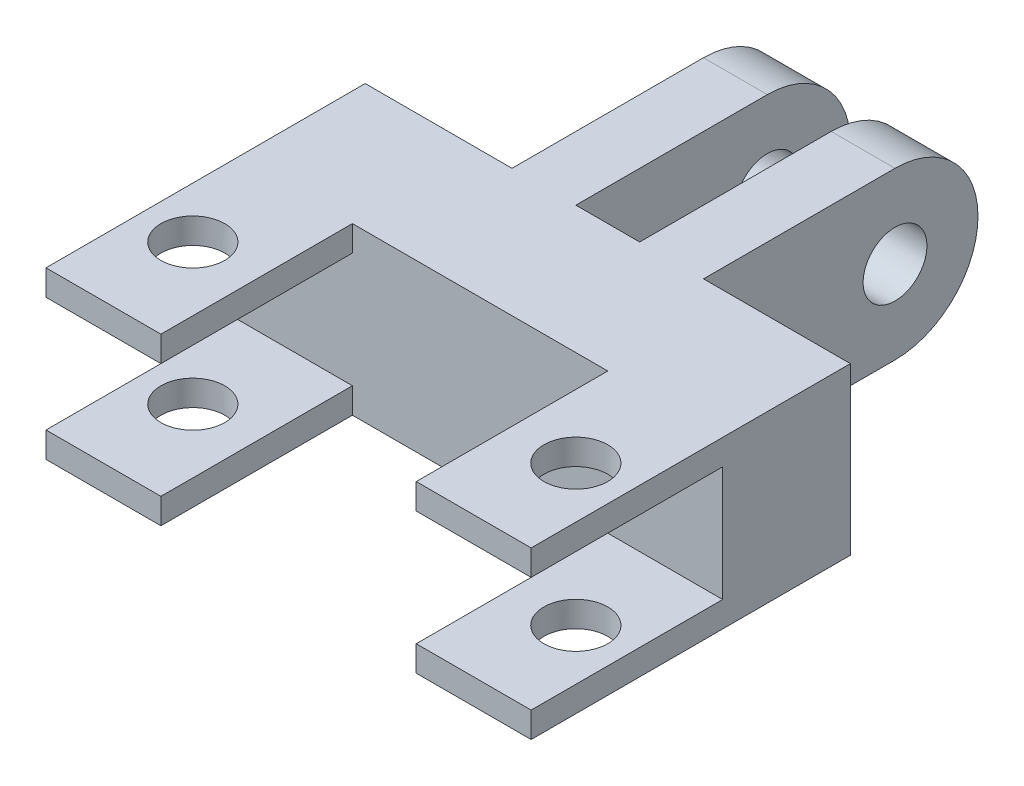
ISO-10303-21;
HEADER;
FILE_DESCRIPTION(('STEP AP214'),'2;1');
FILE_NAME('part.step','',(''),(''),'','','');
FILE_SCHEMA(('AUTOMOTIVE_DESIGN { 1 0 10303 214 1 1 1 1 }'));
ENDSEC;
DATA;
#1=APPLICATION_CONTEXT('core data for automotive mechanical design processes');
#2=APPLICATION_PROTOCOL_DEFINITION('international standard','automotive_design',2000,#1);
#3=PRODUCT_CONTEXT('',#1,'mechanical');
#4=PRODUCT('Part','Part','',(#3));
#5=PRODUCT_RELATED_PRODUCT_CATEGORY('part','',(#4));
#6=PRODUCT_DEFINITION_FORMATION('','',#4);
#7=PRODUCT_DEFINITION_CONTEXT('part definition',#1,'design');
#8=PRODUCT_DEFINITION('design','',#6,#7);
#9=PRODUCT_DEFINITION_SHAPE('','',#8);
#10=(LENGTH_UNIT() NAMED_UNIT(*) SI_UNIT(.MILLI.,.METRE.));
#11=(NAMED_UNIT(*) PLANE_ANGLE_UNIT() SI_UNIT($,.RADIAN.));
#12=(NAMED_UNIT(*) SI_UNIT($,.STERADIAN.) SOLID_ANGLE_UNIT());
#13=UNCERTAINTY_MEASURE_WITH_UNIT(LENGTH_MEASURE(1.E-05),#10,'distance_accuracy_value','');
#14=(GEOMETRIC_REPRESENTATION_CONTEXT(3) GLOBAL_UNCERTAINTY_ASSIGNED_CONTEXT((#13)) GLOBAL_UNIT_ASSIGNED_CONTEXT((#10,
#11,#12)) REPRESENTATION_CONTEXT('',''));
#15=CARTESIAN_POINT('',(0.,0.,0.));
#16=DIRECTION('',(0.,0.,1.));
#17=DIRECTION('',(1.,0.,0.));
#18=AXIS2_PLACEMENT_3D('',#15,#16,#17);
#19=CARTESIAN_POINT('',(7.5,0.,-15.));
#20=DIRECTION('',(-1.,0.,0.));
#21=DIRECTION('',(0.,0.,1.));
#22=AXIS2_PLACEMENT_3D('',#19,#20,#21);
#23=CYLINDRICAL_SURFACE('',#22,6.5);
#24=DIRECTION('',(-1.,0.,0.));
#25=VECTOR('',#24,1.);
#26=CARTESIAN_POINT('',(7.5,-6.5,-15.));
#27=LINE('',#26,#25);
#28=CARTESIAN_POINT('',(7.5,-6.5,-15.));
#29=VERTEX_POINT('',#28);
#30=CARTESIAN_POINT('',(2.5,-6.5,-15.));
#31=VERTEX_POINT('',#30);
#32=EDGE_CURVE('E288',#29,#31,#27,.T.);
#33=ORIENTED_EDGE('',*,*,#32,.T.);
#34=CARTESIAN_POINT('',(2.5,0.,-15.));
#35=DIRECTION('',(1.,0.,0.));
#36=DIRECTION('',(0.,0.,-1.));
#37=AXIS2_PLACEMENT_3D('',#34,#35,#36);
#38=CIRCLE('',#37,6.5);
#39=CARTESIAN_POINT('',(2.5,6.5,-15.));
#40=VERTEX_POINT('',#39);
#41=EDGE_CURVE('E244',#31,#40,#38,.T.);
#42=ORIENTED_EDGE('',*,*,#41,.T.);
#43=DIRECTION('',(-1.,0.,0.));
#44=VECTOR('',#43,1.);
#45=CARTESIAN_POINT('',(7.5,6.5,-15.));
#46=LINE('',#45,#44);
#47=CARTESIAN_POINT('',(7.5,6.5,-15.));
#48=VERTEX_POINT('',#47);
#49=EDGE_CURVE('E284',#48,#40,#46,.T.);
#50=ORIENTED_EDGE('',*,*,#49,.F.);
#51=CARTESIAN_POINT('',(7.5,0.,-15.));
#52=DIRECTION('',(1.,0.,0.));
#53=DIRECTION('',(0.,0.,1.));
#54=AXIS2_PLACEMENT_3D('',#51,#52,#53);
#55=CIRCLE('',#54,6.5);
#56=EDGE_CURVE('E265',#29,#48,#55,.T.);
#57=ORIENTED_EDGE('',*,*,#56,.F.);
#58=EDGE_LOOP('',(#33,#42,#50,#57));
#59=FACE_BOUND('',#58,.T.);
#60=ADVANCED_FACE('F39',(#59),#23,.T.);
#61=CARTESIAN_POINT('',(7.5,0.,-15.));
#62=DIRECTION('',(-1.,0.,0.));
#63=DIRECTION('',(0.,0.,1.));
#64=AXIS2_PLACEMENT_3D('',#61,#62,#63);
#65=CYLINDRICAL_SURFACE('',#64,2.5);
#66=CARTESIAN_POINT('',(2.5,0.,-15.));
#67=DIRECTION('',(1.,0.,0.));
#68=DIRECTION('',(0.,0.,-1.));
#69=AXIS2_PLACEMENT_3D('',#66,#67,#68);
#70=CIRCLE('',#69,2.5);
#71=CARTESIAN_POINT('',(2.5,0.,-17.5));
#72=VERTEX_POINT('',#71);
#73=EDGE_CURVE('E43',#72,#72,#70,.T.);
#74=ORIENTED_EDGE('',*,*,#73,.F.);
#75=EDGE_LOOP('',(#74));
#76=FACE_BOUND('',#75,.T.);
#77=CARTESIAN_POINT('',(7.5,0.,-15.));
#78=DIRECTION('',(1.,0.,0.));
#79=DIRECTION('',(0.,0.,-1.));
#80=AXIS2_PLACEMENT_3D('',#77,#78,#79);
#81=CIRCLE('',#80,2.5);
#82=CARTESIAN_POINT('',(7.5,0.,-17.5));
#83=VERTEX_POINT('',#82);
#84=EDGE_CURVE('E249',#83,#83,#81,.T.);
#85=ORIENTED_EDGE('',*,*,#84,.T.);
#86=EDGE_LOOP('',(#85));
#87=FACE_BOUND('',#86,.T.);
#88=ADVANCED_FACE('F481',(#76,#87),#65,.F.);
#89=CARTESIAN_POINT('',(0.,0.,0.));
#90=DIRECTION('',(0.,0.,1.));
#91=DIRECTION('',(1.,0.,0.));
#92=AXIS2_PLACEMENT_3D('',#89,#90,#91);
#93=PLANE('',#92);
#94=DIRECTION('',(0.,-1.,0.));
#95=VECTOR('',#94,1.);
#96=CARTESIAN_POINT('',(7.5,-6.5,0.));
#97=LINE('',#96,#95);
#98=CARTESIAN_POINT('',(7.5,6.5,0.));
#99=VERTEX_POINT('',#98);
#100=CARTESIAN_POINT('',(7.5,-6.5,0.));
#101=VERTEX_POINT('',#100);
#102=EDGE_CURVE('E257',#99,#101,#97,.T.);
#103=ORIENTED_EDGE('',*,*,#102,.F.);
#104=DIRECTION('',(-1.,0.,0.));
#105=VECTOR('',#104,1.);
#106=CARTESIAN_POINT('',(-19.,6.5,0.));
#107=LINE('',#106,#105);
#108=CARTESIAN_POINT('',(19.,6.5,0.));
#109=VERTEX_POINT('',#108);
#110=EDGE_CURVE('E425',#109,#99,#107,.T.);
#111=ORIENTED_EDGE('',*,*,#110,.F.);
#112=DIRECTION('',(0.,1.,0.));
#113=VECTOR('',#112,1.);
#114=CARTESIAN_POINT('',(19.,6.5,0.));
#115=LINE('',#114,#113);
#116=CARTESIAN_POINT('',(19.,-6.5,0.));
#117=VERTEX_POINT('',#116);
#118=EDGE_CURVE('E400',#117,#109,#115,.T.);
#119=ORIENTED_EDGE('',*,*,#118,.F.);
#120=DIRECTION('',(1.,0.,0.));
#121=VECTOR('',#120,1.);
#122=CARTESIAN_POINT('',(-19.,-6.5,0.));
#123=LINE('',#122,#121);
#124=EDGE_CURVE('E432',#101,#117,#123,.T.);
#125=ORIENTED_EDGE('',*,*,#124,.F.);
#126=EDGE_LOOP('',(#103,#111,#119,#125));
#127=FACE_BOUND('',#126,.T.);
#128=ADVANCED_FACE('F504',(#127),#93,.F.);
#129=CARTESIAN_POINT('',(0.,0.,25.));
#130=DIRECTION('',(0.,0.,1.));
#131=DIRECTION('',(1.,0.,0.));
#132=AXIS2_PLACEMENT_3D('',#129,#130,#131);
#133=PLANE('',#132);
#134=DIRECTION('',(0.,1.,0.));
#135=VECTOR('',#134,1.);
#136=CARTESIAN_POINT('',(10.,0.,25.));
#137=LINE('',#136,#135);
#138=CARTESIAN_POINT('',(10.,-6.5,25.));
#139=VERTEX_POINT('',#138);
#140=CARTESIAN_POINT('',(10.,-4.49999999999999,25.));
#141=VERTEX_POINT('',#140);
#142=EDGE_CURVE('E368',#139,#141,#137,.T.);
#143=ORIENTED_EDGE('',*,*,#142,.F.);
#144=DIRECTION('',(1.,0.,0.));
#145=VECTOR('',#144,1.);
#146=CARTESIAN_POINT('',(-19.,-6.5,25.));
#147=LINE('',#146,#145);
#148=CARTESIAN_POINT('',(19.,-6.5,25.));
#149=VERTEX_POINT('',#148);
#150=EDGE_CURVE('E416',#139,#149,#147,.T.);
#151=ORIENTED_EDGE('',*,*,#150,.T.);
#152=DIRECTION('',(0.,1.,0.));
#153=VECTOR('',#152,1.);
#154=CARTESIAN_POINT('',(19.,6.5,25.));
#155=LINE('',#154,#153);
#156=CARTESIAN_POINT('',(19.,-4.49999999999999,25.));
#157=VERTEX_POINT('',#156);
#158=EDGE_CURVE('E401',#149,#157,#155,.T.);
#159=ORIENTED_EDGE('',*,*,#158,.T.);
#160=DIRECTION('',(1.,0.,0.));
#161=VECTOR('',#160,1.);
#162=CARTESIAN_POINT('',(0.,-4.5,25.));
#163=LINE('',#162,#161);
#164=EDGE_CURVE('E457',#141,#157,#163,.T.);
#165=ORIENTED_EDGE('',*,*,#164,.F.);
#166=EDGE_LOOP('',(#143,#151,#159,#165));
#167=FACE_BOUND('',#166,.T.);
#168=ADVANCED_FACE('F545',(#167),#133,.T.);
#169=DIRECTION('',(0.,1.,0.));
#170=VECTOR('',#169,1.);
#171=CARTESIAN_POINT('',(10.,0.,25.));
#172=LINE('',#171,#170);
#173=CARTESIAN_POINT('',(10.,4.50000000000001,25.));
#174=VERTEX_POINT('',#173);
#175=CARTESIAN_POINT('',(10.,6.5,25.));
#176=VERTEX_POINT('',#175);
#177=EDGE_CURVE('E361',#174,#176,#172,.T.);
#178=ORIENTED_EDGE('',*,*,#177,.F.);
#179=DIRECTION('',(-1.,0.,0.));
#180=VECTOR('',#179,1.);
#181=CARTESIAN_POINT('',(0.,4.5,25.));
#182=LINE('',#181,#180);
#183=CARTESIAN_POINT('',(19.,4.5,25.));
#184=VERTEX_POINT('',#183);
#185=EDGE_CURVE('E453',#184,#174,#182,.T.);
#186=ORIENTED_EDGE('',*,*,#185,.F.);
#187=CARTESIAN_POINT('',(19.,6.5,25.));
#188=VERTEX_POINT('',#187);
#189=EDGE_CURVE('E406',#184,#188,#155,.T.);
#190=ORIENTED_EDGE('',*,*,#189,.T.);
#191=DIRECTION('',(-1.,0.,0.));
#192=VECTOR('',#191,1.);
#193=CARTESIAN_POINT('',(-19.,6.5,25.));
#194=LINE('',#193,#192);
#195=EDGE_CURVE('E407',#188,#176,#194,.T.);
#196=ORIENTED_EDGE('',*,*,#195,.T.);
#197=EDGE_LOOP('',(#178,#186,#190,#196));
#198=FACE_BOUND('',#197,.T.);
#199=ADVANCED_FACE('F744',(#198),#133,.T.);
#200=CARTESIAN_POINT('',(-25.1368421052634,-4.5,10.));
#201=DIRECTION('',(0.,-1.,0.));
#202=DIRECTION('',(1.,0.,0.));
#203=AXIS2_PLACEMENT_3D('',#200,#201,#202);
#204=PLANE('',#203);
#205=CARTESIAN_POINT('',(15.,-4.49999999999999,17.5));
#206=DIRECTION('',(0.,-1.,0.));
#207=DIRECTION('',(1.,0.,0.));
#208=AXIS2_PLACEMENT_3D('',#205,#206,#207);
#209=CIRCLE('',#208,2.5);
#210=CARTESIAN_POINT('',(17.5,-4.49999999999999,17.5));
#211=VERTEX_POINT('',#210);
#212=EDGE_CURVE('E317',#211,#211,#209,.T.);
#213=ORIENTED_EDGE('',*,*,#212,.T.);
#214=EDGE_LOOP('',(#213));
#215=FACE_BOUND('',#214,.T.);
#216=DIRECTION('',(1.,0.,0.));
#217=VECTOR('',#216,1.);
#218=CARTESIAN_POINT('',(-25.1368421052634,-4.5,10.));
#219=LINE('',#218,#217);
#220=CARTESIAN_POINT('',(10.,-4.49999999999999,10.));
#221=VERTEX_POINT('',#220);
#222=CARTESIAN_POINT('',(19.,-4.49999999999999,10.));
#223=VERTEX_POINT('',#222);
#224=EDGE_CURVE('E376',#221,#223,#219,.T.);
#225=ORIENTED_EDGE('',*,*,#224,.F.);
#226=DIRECTION('',(0.,0.,1.));
#227=VECTOR('',#226,1.);
#228=CARTESIAN_POINT('',(10.,-4.49999999999999,10.));
#229=LINE('',#228,#227);
#230=EDGE_CURVE('E364',#221,#141,#229,.T.);
#231=ORIENTED_EDGE('',*,*,#230,.T.);
#232=ORIENTED_EDGE('',*,*,#164,.T.);
#233=DIRECTION('',(0.,0.,1.));
#234=VECTOR('',#233,1.);
#235=CARTESIAN_POINT('',(19.,-4.49999999999999,25.));
#236=LINE('',#235,#234);
#237=EDGE_CURVE('E393',#223,#157,#236,.T.);
#238=ORIENTED_EDGE('',*,*,#237,.F.);
#239=EDGE_LOOP('',(#225,#231,#232,#238));
#240=FACE_BOUND('',#239,.T.);
#241=ADVANCED_FACE('F536',(#215,#240),#204,.F.);
#242=CARTESIAN_POINT('',(-25.1368421052634,4.5,10.));
#243=DIRECTION('',(0.,1.,0.));
#244=DIRECTION('',(-1.,0.,0.));
#245=AXIS2_PLACEMENT_3D('',#242,#243,#244);
#246=PLANE('',#245);
#247=CARTESIAN_POINT('',(15.,4.50000000000001,17.5));
#248=DIRECTION('',(0.,1.,0.));
#249=DIRECTION('',(-1.,0.,0.));
#250=AXIS2_PLACEMENT_3D('',#247,#248,#249);
#251=CIRCLE('',#250,2.5);
#252=CARTESIAN_POINT('',(12.5,4.50000000000001,17.5));
#253=VERTEX_POINT('',#252);
#254=EDGE_CURVE('E313',#253,#253,#251,.T.);
#255=ORIENTED_EDGE('',*,*,#254,.T.);
#256=EDGE_LOOP('',(#255));
#257=FACE_BOUND('',#256,.T.);
#258=ORIENTED_EDGE('',*,*,#185,.T.);
#259=DIRECTION('',(0.,0.,-1.));
#260=VECTOR('',#259,1.);
#261=CARTESIAN_POINT('',(10.,4.50000000000001,10.));
#262=LINE('',#261,#260);
#263=CARTESIAN_POINT('',(10.,4.5,10.));
#264=VERTEX_POINT('',#263);
#265=EDGE_CURVE('E11',#174,#264,#262,.T.);
#266=ORIENTED_EDGE('',*,*,#265,.T.);
#267=DIRECTION('',(-1.,0.,0.));
#268=VECTOR('',#267,1.);
#269=CARTESIAN_POINT('',(-25.1368421052634,4.5,10.));
#270=LINE('',#269,#268);
#271=CARTESIAN_POINT('',(19.,4.50000000000001,10.));
#272=VERTEX_POINT('',#271);
#273=EDGE_CURVE('E372',#272,#264,#270,.T.);
#274=ORIENTED_EDGE('',*,*,#273,.F.);
#275=DIRECTION('',(0.,0.,-1.));
#276=VECTOR('',#275,1.);
#277=CARTESIAN_POINT('',(19.,4.50000000000001,25.));
#278=LINE('',#277,#276);
#279=EDGE_CURVE('E385',#184,#272,#278,.T.);
#280=ORIENTED_EDGE('',*,*,#279,.F.);
#281=EDGE_LOOP('',(#258,#266,#274,#280));
#282=FACE_BOUND('',#281,.T.);
#283=ADVANCED_FACE('F540',(#257,#282),#246,.F.);
#284=DIRECTION('',(0.,-1.,0.));
#285=VECTOR('',#284,1.);
#286=CARTESIAN_POINT('',(-10.,0.,25.));
#287=LINE('',#286,#285);
#288=CARTESIAN_POINT('',(-10.,-4.5,25.));
#289=VERTEX_POINT('',#288);
#290=CARTESIAN_POINT('',(-10.,-6.5,25.));
#291=VERTEX_POINT('',#290);
#292=EDGE_CURVE('E358',#289,#291,#287,.T.);
#293=ORIENTED_EDGE('',*,*,#292,.F.);
#294=CARTESIAN_POINT('',(-19.,-4.5,25.));
#295=VERTEX_POINT('',#294);
#296=EDGE_CURVE('E458',#295,#289,#163,.T.);
#297=ORIENTED_EDGE('',*,*,#296,.F.);
#298=DIRECTION('',(0.,-1.,0.));
#299=VECTOR('',#298,1.);
#300=CARTESIAN_POINT('',(-19.,6.5,25.));
#301=LINE('',#300,#299);
#302=CARTESIAN_POINT('',(-19.,-6.5,25.));
#303=VERTEX_POINT('',#302);
#304=EDGE_CURVE('E411',#295,#303,#301,.T.);
#305=ORIENTED_EDGE('',*,*,#304,.T.);
#306=EDGE_CURVE('E417',#303,#291,#147,.T.);
#307=ORIENTED_EDGE('',*,*,#306,.T.);
#308=EDGE_LOOP('',(#293,#297,#305,#307));
#309=FACE_BOUND('',#308,.T.);
#310=ADVANCED_FACE('F546',(#309),#133,.T.);
#311=CARTESIAN_POINT('',(19.,6.5,25.));
#312=DIRECTION('',(-1.,0.,0.));
#313=DIRECTION('',(0.,0.,1.));
#314=AXIS2_PLACEMENT_3D('',#311,#312,#313);
#315=PLANE('',#314);
#316=DIRECTION('',(0.,1.,0.));
#317=VECTOR('',#316,1.);
#318=CARTESIAN_POINT('',(19.,6.5,10.));
#319=LINE('',#318,#317);
#320=EDGE_CURVE('E397',#223,#272,#319,.T.);
#321=ORIENTED_EDGE('',*,*,#320,.F.);
#322=ORIENTED_EDGE('',*,*,#237,.T.);
#323=ORIENTED_EDGE('',*,*,#158,.F.);
#324=DIRECTION('',(0.,0.,-1.));
#325=VECTOR('',#324,1.);
#326=CARTESIAN_POINT('',(19.,-6.5,25.));
#327=LINE('',#326,#325);
#328=EDGE_CURVE('E421',#149,#117,#327,.T.);
#329=ORIENTED_EDGE('',*,*,#328,.T.);
#330=ORIENTED_EDGE('',*,*,#118,.T.);
#331=DIRECTION('',(0.,0.,-1.));
#332=VECTOR('',#331,1.);
#333=CARTESIAN_POINT('',(19.,6.5,25.));
#334=LINE('',#333,#332);
#335=EDGE_CURVE('E448',#188,#109,#334,.T.);
#336=ORIENTED_EDGE('',*,*,#335,.F.);
#337=ORIENTED_EDGE('',*,*,#189,.F.);
#338=ORIENTED_EDGE('',*,*,#279,.T.);
#339=EDGE_LOOP('',(#321,#322,#323,#329,#330,#336,#337,#338));
#340=FACE_BOUND('',#339,.T.);
#341=ADVANCED_FACE('F41',(#340),#315,.F.);
#342=CARTESIAN_POINT('',(-19.,6.5,25.));
#343=DIRECTION('',(0.,-1.,0.));
#344=DIRECTION('',(0.,0.,-1.));
#345=AXIS2_PLACEMENT_3D('',#342,#343,#344);
#346=PLANE('',#345);
#347=CARTESIAN_POINT('',(-15.,6.5,17.5));
#348=DIRECTION('',(0.,1.,0.));
#349=DIRECTION('',(0.,0.,1.));
#350=AXIS2_PLACEMENT_3D('',#347,#348,#349);
#351=CIRCLE('',#350,2.5);
#352=CARTESIAN_POINT('',(-15.,6.5,20.));
#353=VERTEX_POINT('',#352);
#354=EDGE_CURVE('E298',#353,#353,#351,.T.);
#355=ORIENTED_EDGE('',*,*,#354,.F.);
#356=EDGE_LOOP('',(#355));
#357=FACE_BOUND('',#356,.T.);
#358=CARTESIAN_POINT('',(15.,6.5,17.5));
#359=DIRECTION('',(0.,1.,0.));
#360=DIRECTION('',(0.,0.,-1.));
#361=AXIS2_PLACEMENT_3D('',#358,#359,#360);
#362=CIRCLE('',#361,2.5);
#363=CARTESIAN_POINT('',(15.,6.5,15.));
#364=VERTEX_POINT('',#363);
#365=EDGE_CURVE('E292',#364,#364,#362,.T.);
#366=ORIENTED_EDGE('',*,*,#365,.F.);
#367=EDGE_LOOP('',(#366));
#368=FACE_BOUND('',#367,.T.);
#369=ORIENTED_EDGE('',*,*,#49,.T.);
#370=DIRECTION('',(0.,0.,-1.));
#371=VECTOR('',#370,1.);
#372=CARTESIAN_POINT('',(2.5,6.5,-54.9369545779224));
#373=LINE('',#372,#371);
#374=CARTESIAN_POINT('',(2.5,6.5,0.));
#375=VERTEX_POINT('',#374);
#376=EDGE_CURVE('E231',#375,#40,#373,.T.);
#377=ORIENTED_EDGE('',*,*,#376,.F.);
#378=DIRECTION('',(1.,0.,0.));
#379=VECTOR('',#378,1.);
#380=CARTESIAN_POINT('',(-2.5,6.5,0.));
#381=LINE('',#380,#379);
#382=CARTESIAN_POINT('',(-2.5,6.5,0.));
#383=VERTEX_POINT('',#382);
#384=EDGE_CURVE('E228',#383,#375,#381,.T.);
#385=ORIENTED_EDGE('',*,*,#384,.F.);
#386=DIRECTION('',(0.,0.,1.));
#387=VECTOR('',#386,1.);
#388=CARTESIAN_POINT('',(-2.5,6.5,-54.9369545779224));
#389=LINE('',#388,#387);
#390=CARTESIAN_POINT('',(-2.5,6.5,-15.));
#391=VERTEX_POINT('',#390);
#392=EDGE_CURVE('E205',#391,#383,#389,.T.);
#393=ORIENTED_EDGE('',*,*,#392,.F.);
#394=CARTESIAN_POINT('',(-7.5,6.5,-15.));
#395=VERTEX_POINT('',#394);
#396=EDGE_CURVE('E272',#391,#395,#46,.T.);
#397=ORIENTED_EDGE('',*,*,#396,.T.);
#398=DIRECTION('',(0.,0.,1.));
#399=VECTOR('',#398,1.);
#400=CARTESIAN_POINT('',(-7.5,6.5,-15.));
#401=LINE('',#400,#399);
#402=CARTESIAN_POINT('',(-7.5,6.5,0.));
#403=VERTEX_POINT('',#402);
#404=EDGE_CURVE('E262',#395,#403,#401,.T.);
#405=ORIENTED_EDGE('',*,*,#404,.T.);
#406=CARTESIAN_POINT('',(-19.,6.5,0.));
#407=VERTEX_POINT('',#406);
#408=EDGE_CURVE('E65',#403,#407,#107,.T.);
#409=ORIENTED_EDGE('',*,*,#408,.T.);
#410=DIRECTION('',(0.,0.,-1.));
#411=VECTOR('',#410,1.);
#412=CARTESIAN_POINT('',(-19.,6.5,25.));
#413=LINE('',#412,#411);
#414=CARTESIAN_POINT('',(-19.,6.5,25.));
#415=VERTEX_POINT('',#414);
#416=EDGE_CURVE('E444',#415,#407,#413,.T.);
#417=ORIENTED_EDGE('',*,*,#416,.F.);
#418=CARTESIAN_POINT('',(-10.,6.5,25.));
#419=VERTEX_POINT('',#418);
#420=EDGE_CURVE('E405',#419,#415,#194,.T.);
#421=ORIENTED_EDGE('',*,*,#420,.F.);
#422=DIRECTION('',(0.,0.,1.));
#423=VECTOR('',#422,1.);
#424=CARTESIAN_POINT('',(-10.,6.5,10.));
#425=LINE('',#424,#423);
#426=CARTESIAN_POINT('',(-10.,6.5,10.));
#427=VERTEX_POINT('',#426);
#428=EDGE_CURVE('E327',#427,#419,#425,.T.);
#429=ORIENTED_EDGE('',*,*,#428,.F.);
#430=DIRECTION('',(-1.,0.,0.));
#431=VECTOR('',#430,1.);
#432=CARTESIAN_POINT('',(-10.,6.5,10.));
#433=LINE('',#432,#431);
#434=CARTESIAN_POINT('',(10.,6.5,10.));
#435=VERTEX_POINT('',#434);
#436=EDGE_CURVE('E338',#435,#427,#433,.T.);
#437=ORIENTED_EDGE('',*,*,#436,.F.);
#438=DIRECTION('',(0.,0.,-1.));
#439=VECTOR('',#438,1.);
#440=CARTESIAN_POINT('',(10.,6.5,10.));
#441=LINE('',#440,#439);
#442=EDGE_CURVE('E321',#176,#435,#441,.T.);
#443=ORIENTED_EDGE('',*,*,#442,.F.);
#444=ORIENTED_EDGE('',*,*,#195,.F.);
#445=ORIENTED_EDGE('',*,*,#335,.T.);
#446=ORIENTED_EDGE('',*,*,#110,.T.);
#447=DIRECTION('',(0.,0.,1.));
#448=VECTOR('',#447,1.);
#449=CARTESIAN_POINT('',(7.5,6.5,-15.));
#450=LINE('',#449,#448);
#451=EDGE_CURVE('E268',#48,#99,#450,.T.);
#452=ORIENTED_EDGE('',*,*,#451,.F.);
#453=EDGE_LOOP('',(#369,#377,#385,#393,#397,#405,#409,#417,#421,#429,#437,#443,#444,#445,#446,#452));
#454=FACE_BOUND('',#453,.T.);
#455=ADVANCED_FACE('F554',(#357,#368,#454),#346,.F.);
#456=CARTESIAN_POINT('',(-19.,6.5,25.));
#457=DIRECTION('',(1.,0.,0.));
#458=DIRECTION('',(0.,0.,-1.));
#459=AXIS2_PLACEMENT_3D('',#456,#457,#458);
#460=PLANE('',#459);
#461=ORIENTED_EDGE('',*,*,#304,.F.);
#462=DIRECTION('',(0.,0.,-1.));
#463=VECTOR('',#462,1.);
#464=CARTESIAN_POINT('',(-19.,-4.5,25.));
#465=LINE('',#464,#463);
#466=CARTESIAN_POINT('',(-19.,-4.5,10.));
#467=VERTEX_POINT('',#466);
#468=EDGE_CURVE('E389',#295,#467,#465,.T.);
#469=ORIENTED_EDGE('',*,*,#468,.T.);
#470=DIRECTION('',(0.,-1.,0.));
#471=VECTOR('',#470,1.);
#472=CARTESIAN_POINT('',(-19.,6.5,10.));
#473=LINE('',#472,#471);
#474=CARTESIAN_POINT('',(-19.,4.5,10.));
#475=VERTEX_POINT('',#474);
#476=EDGE_CURVE('E462',#475,#467,#473,.T.);
#477=ORIENTED_EDGE('',*,*,#476,.F.);
#478=DIRECTION('',(0.,0.,1.));
#479=VECTOR('',#478,1.);
#480=CARTESIAN_POINT('',(-19.,4.5,25.));
#481=LINE('',#480,#479);
#482=CARTESIAN_POINT('',(-19.,4.5,25.));
#483=VERTEX_POINT('',#482);
#484=EDGE_CURVE('E381',#475,#483,#481,.T.);
#485=ORIENTED_EDGE('',*,*,#484,.T.);
#486=EDGE_CURVE('E412',#415,#483,#301,.T.);
#487=ORIENTED_EDGE('',*,*,#486,.F.);
#488=ORIENTED_EDGE('',*,*,#416,.T.);
#489=DIRECTION('',(0.,-1.,0.));
#490=VECTOR('',#489,1.);
#491=CARTESIAN_POINT('',(-19.,6.5,0.));
#492=LINE('',#491,#490);
#493=CARTESIAN_POINT('',(-19.,-6.5,0.));
#494=VERTEX_POINT('',#493);
#495=EDGE_CURVE('E429',#407,#494,#492,.T.);
#496=ORIENTED_EDGE('',*,*,#495,.T.);
#497=DIRECTION('',(0.,0.,-1.));
#498=VECTOR('',#497,1.);
#499=CARTESIAN_POINT('',(-19.,-6.5,25.));
#500=LINE('',#499,#498);
#501=EDGE_CURVE('E440',#303,#494,#500,.T.);
#502=ORIENTED_EDGE('',*,*,#501,.F.);
#503=EDGE_LOOP('',(#461,#469,#477,#485,#487,#488,#496,#502));
#504=FACE_BOUND('',#503,.T.);
#505=ADVANCED_FACE('F551',(#504),#460,.F.);
#506=CARTESIAN_POINT('',(-19.,-6.5,25.));
#507=DIRECTION('',(0.,1.,0.));
#508=DIRECTION('',(0.,0.,1.));
#509=AXIS2_PLACEMENT_3D('',#506,#507,#508);
#510=PLANE('',#509);
#511=CARTESIAN_POINT('',(-15.,-6.5,17.5));
#512=DIRECTION('',(0.,1.,0.));
#513=DIRECTION('',(0.,0.,1.));
#514=AXIS2_PLACEMENT_3D('',#511,#512,#513);
#515=CIRCLE('',#514,2.5);
#516=CARTESIAN_POINT('',(-15.,-6.5,20.));
#517=VERTEX_POINT('',#516);
#518=EDGE_CURVE('E293',#517,#517,#515,.T.);
#519=ORIENTED_EDGE('',*,*,#518,.T.);
#520=EDGE_LOOP('',(#519));
#521=FACE_BOUND('',#520,.T.);
#522=CARTESIAN_POINT('',(15.,-6.5,17.5));
#523=DIRECTION('',(0.,1.,0.));
#524=DIRECTION('',(0.,0.,-1.));
#525=AXIS2_PLACEMENT_3D('',#522,#523,#524);
#526=CIRCLE('',#525,2.5);
#527=CARTESIAN_POINT('',(15.,-6.5,15.));
#528=VERTEX_POINT('',#527);
#529=EDGE_CURVE('E302',#528,#528,#526,.T.);
#530=ORIENTED_EDGE('',*,*,#529,.T.);
#531=EDGE_LOOP('',(#530));
#532=FACE_BOUND('',#531,.T.);
#533=DIRECTION('',(1.,0.,0.));
#534=VECTOR('',#533,1.);
#535=CARTESIAN_POINT('',(-2.5,-6.5,0.));
#536=LINE('',#535,#534);
#537=CARTESIAN_POINT('',(-2.5,-6.5,0.));
#538=VERTEX_POINT('',#537);
#539=CARTESIAN_POINT('',(2.5,-6.5,0.));
#540=VERTEX_POINT('',#539);
#541=EDGE_CURVE('E211',#538,#540,#536,.T.);
#542=ORIENTED_EDGE('',*,*,#541,.T.);
#543=DIRECTION('',(0.,0.,-1.));
#544=VECTOR('',#543,1.);
#545=CARTESIAN_POINT('',(2.5,-6.5,-54.9369545779224));
#546=LINE('',#545,#544);
#547=EDGE_CURVE('E225',#540,#31,#546,.T.);
#548=ORIENTED_EDGE('',*,*,#547,.T.);
#549=ORIENTED_EDGE('',*,*,#32,.F.);
#550=DIRECTION('',(0.,0.,-1.));
#551=VECTOR('',#550,1.);
#552=CARTESIAN_POINT('',(7.5,-6.5,-15.));
#553=LINE('',#552,#551);
#554=EDGE_CURVE('E261',#101,#29,#553,.T.);
#555=ORIENTED_EDGE('',*,*,#554,.F.);
#556=ORIENTED_EDGE('',*,*,#124,.T.);
#557=ORIENTED_EDGE('',*,*,#328,.F.);
#558=ORIENTED_EDGE('',*,*,#150,.F.);
#559=DIRECTION('',(0.,0.,-1.));
#560=VECTOR('',#559,1.);
#561=CARTESIAN_POINT('',(10.,-6.5,10.));
#562=LINE('',#561,#560);
#563=CARTESIAN_POINT('',(10.,-6.5,10.));
#564=VERTEX_POINT('',#563);
#565=EDGE_CURVE('E322',#139,#564,#562,.T.);
#566=ORIENTED_EDGE('',*,*,#565,.T.);
#567=DIRECTION('',(-1.,0.,0.));
#568=VECTOR('',#567,1.);
#569=CARTESIAN_POINT('',(-10.,-6.5,10.));
#570=LINE('',#569,#568);
#571=CARTESIAN_POINT('',(-10.,-6.5,10.));
#572=VERTEX_POINT('',#571);
#573=EDGE_CURVE('E326',#564,#572,#570,.T.);
#574=ORIENTED_EDGE('',*,*,#573,.T.);
#575=DIRECTION('',(0.,0.,1.));
#576=VECTOR('',#575,1.);
#577=CARTESIAN_POINT('',(-10.,-6.5,10.));
#578=LINE('',#577,#576);
#579=EDGE_CURVE('E331',#572,#291,#578,.T.);
#580=ORIENTED_EDGE('',*,*,#579,.T.);
#581=ORIENTED_EDGE('',*,*,#306,.F.);
#582=ORIENTED_EDGE('',*,*,#501,.T.);
#583=CARTESIAN_POINT('',(-7.5,-6.5,0.));
#584=VERTEX_POINT('',#583);
#585=EDGE_CURVE('E433',#494,#584,#123,.T.);
#586=ORIENTED_EDGE('',*,*,#585,.T.);
#587=DIRECTION('',(0.,0.,-1.));
#588=VECTOR('',#587,1.);
#589=CARTESIAN_POINT('',(-7.5,-6.5,-15.));
#590=LINE('',#589,#588);
#591=CARTESIAN_POINT('',(-7.5,-6.5,-15.));
#592=VERTEX_POINT('',#591);
#593=EDGE_CURVE('E275',#584,#592,#590,.T.);
#594=ORIENTED_EDGE('',*,*,#593,.T.);
#595=CARTESIAN_POINT('',(-2.5,-6.5,-15.));
#596=VERTEX_POINT('',#595);
#597=EDGE_CURVE('E223',#596,#592,#27,.T.);
#598=ORIENTED_EDGE('',*,*,#597,.F.);
#599=DIRECTION('',(0.,0.,1.));
#600=VECTOR('',#599,1.);
#601=CARTESIAN_POINT('',(-2.5,-6.5,-54.9369545779224));
#602=LINE('',#601,#600);
#603=EDGE_CURVE('E57',#596,#538,#602,.T.);
#604=ORIENTED_EDGE('',*,*,#603,.T.);
#605=EDGE_LOOP('',(#542,#548,#549,#555,#556,#557,#558,#566,#574,#580,#581,#582,#586,#594,#598,#604));
#606=FACE_BOUND('',#605,.T.);
#607=ADVANCED_FACE('F221',(#521,#532,#606),#510,.F.);
#608=DIRECTION('',(0.,-1.,0.));
#609=VECTOR('',#608,1.);
#610=CARTESIAN_POINT('',(-10.,0.,25.));
#611=LINE('',#610,#609);
#612=CARTESIAN_POINT('',(-10.,4.5,25.));
#613=VERTEX_POINT('',#612);
#614=EDGE_CURVE('E347',#419,#613,#611,.T.);
#615=ORIENTED_EDGE('',*,*,#614,.F.);
#616=ORIENTED_EDGE('',*,*,#420,.T.);
#617=ORIENTED_EDGE('',*,*,#486,.T.);
#618=EDGE_CURVE('E452',#613,#483,#182,.T.);
#619=ORIENTED_EDGE('',*,*,#618,.F.);
#620=EDGE_LOOP('',(#615,#616,#617,#619));
#621=FACE_BOUND('',#620,.T.);
#622=ADVANCED_FACE('F541',(#621),#133,.T.);
#623=ORIENTED_EDGE('',*,*,#408,.F.);
#624=DIRECTION('',(0.,-1.,0.));
#625=VECTOR('',#624,1.);
#626=CARTESIAN_POINT('',(-7.5,-6.5,0.));
#627=LINE('',#626,#625);
#628=EDGE_CURVE('E253',#403,#584,#627,.T.);
#629=ORIENTED_EDGE('',*,*,#628,.T.);
#630=ORIENTED_EDGE('',*,*,#585,.F.);
#631=ORIENTED_EDGE('',*,*,#495,.F.);
#632=EDGE_LOOP('',(#623,#629,#630,#631));
#633=FACE_BOUND('',#632,.T.);
#634=ADVANCED_FACE('F531',(#633),#93,.F.);
#635=CARTESIAN_POINT('',(0.,0.,10.));
#636=DIRECTION('',(0.,0.,1.));
#637=DIRECTION('',(1.,0.,0.));
#638=AXIS2_PLACEMENT_3D('',#635,#636,#637);
#639=PLANE('',#638);
#640=CARTESIAN_POINT('',(-10.,-4.5,10.));
#641=VERTEX_POINT('',#640);
#642=EDGE_CURVE('E377',#467,#641,#219,.T.);
#643=ORIENTED_EDGE('',*,*,#642,.T.);
#644=DIRECTION('',(0.,1.,0.));
#645=VECTOR('',#644,1.);
#646=CARTESIAN_POINT('',(-10.,-6.5,10.));
#647=LINE('',#646,#645);
#648=EDGE_CURVE('E344',#572,#641,#647,.T.);
#649=ORIENTED_EDGE('',*,*,#648,.F.);
#650=ORIENTED_EDGE('',*,*,#573,.F.);
#651=DIRECTION('',(0.,1.,0.));
#652=VECTOR('',#651,1.);
#653=CARTESIAN_POINT('',(10.,-6.5,10.));
#654=LINE('',#653,#652);
#655=EDGE_CURVE('E349',#564,#221,#654,.T.);
#656=ORIENTED_EDGE('',*,*,#655,.T.);
#657=ORIENTED_EDGE('',*,*,#224,.T.);
#658=ORIENTED_EDGE('',*,*,#320,.T.);
#659=ORIENTED_EDGE('',*,*,#273,.T.);
#660=EDGE_CURVE('E335',#264,#435,#654,.T.);
#661=ORIENTED_EDGE('',*,*,#660,.T.);
#662=ORIENTED_EDGE('',*,*,#436,.T.);
#663=CARTESIAN_POINT('',(-10.,4.5,10.));
#664=VERTEX_POINT('',#663);
#665=EDGE_CURVE('E348',#664,#427,#647,.T.);
#666=ORIENTED_EDGE('',*,*,#665,.F.);
#667=EDGE_CURVE('E371',#664,#475,#270,.T.);
#668=ORIENTED_EDGE('',*,*,#667,.T.);
#669=ORIENTED_EDGE('',*,*,#476,.T.);
#670=EDGE_LOOP('',(#643,#649,#650,#656,#657,#658,#659,#661,#662,#666,#668,#669));
#671=FACE_BOUND('',#670,.T.);
#672=ADVANCED_FACE('F527',(#671),#639,.T.);
#673=CARTESIAN_POINT('',(-15.,-4.5,17.5));
#674=DIRECTION('',(0.,-1.,0.));
#675=DIRECTION('',(1.,0.,0.));
#676=AXIS2_PLACEMENT_3D('',#673,#674,#675);
#677=CIRCLE('',#676,2.5);
#678=CARTESIAN_POINT('',(-12.5,-4.5,17.5));
#679=VERTEX_POINT('',#678);
#680=EDGE_CURVE('E309',#679,#679,#677,.T.);
#681=ORIENTED_EDGE('',*,*,#680,.T.);
#682=EDGE_LOOP('',(#681));
#683=FACE_BOUND('',#682,.T.);
#684=ORIENTED_EDGE('',*,*,#296,.T.);
#685=DIRECTION('',(0.,0.,-1.));
#686=VECTOR('',#685,1.);
#687=CARTESIAN_POINT('',(-10.,-4.5,10.));
#688=LINE('',#687,#686);
#689=EDGE_CURVE('E354',#289,#641,#688,.T.);
#690=ORIENTED_EDGE('',*,*,#689,.T.);
#691=ORIENTED_EDGE('',*,*,#642,.F.);
#692=ORIENTED_EDGE('',*,*,#468,.F.);
#693=EDGE_LOOP('',(#684,#690,#691,#692));
#694=FACE_BOUND('',#693,.T.);
#695=ADVANCED_FACE('F530',(#683,#694),#204,.F.);
#696=CARTESIAN_POINT('',(-15.,4.5,17.5));
#697=DIRECTION('',(0.,1.,0.));
#698=DIRECTION('',(-1.,0.,0.));
#699=AXIS2_PLACEMENT_3D('',#696,#697,#698);
#700=CIRCLE('',#699,2.5);
#701=CARTESIAN_POINT('',(-17.5,4.5,17.5));
#702=VERTEX_POINT('',#701);
#703=EDGE_CURVE('E297',#702,#702,#700,.T.);
#704=ORIENTED_EDGE('',*,*,#703,.T.);
#705=EDGE_LOOP('',(#704));
#706=FACE_BOUND('',#705,.T.);
#707=ORIENTED_EDGE('',*,*,#667,.F.);
#708=DIRECTION('',(0.,0.,1.));
#709=VECTOR('',#708,1.);
#710=CARTESIAN_POINT('',(-10.,4.5,10.));
#711=LINE('',#710,#709);
#712=EDGE_CURVE('E49',#664,#613,#711,.T.);
#713=ORIENTED_EDGE('',*,*,#712,.T.);
#714=ORIENTED_EDGE('',*,*,#618,.T.);
#715=ORIENTED_EDGE('',*,*,#484,.F.);
#716=EDGE_LOOP('',(#707,#713,#714,#715));
#717=FACE_BOUND('',#716,.T.);
#718=ADVANCED_FACE('F520',(#706,#717),#246,.F.);
#719=CARTESIAN_POINT('',(-10.,-6.5,10.));
#720=DIRECTION('',(-1.,0.,0.));
#721=DIRECTION('',(0.,0.,1.));
#722=AXIS2_PLACEMENT_3D('',#719,#720,#721);
#723=PLANE('',#722);
#724=ORIENTED_EDGE('',*,*,#614,.T.);
#725=ORIENTED_EDGE('',*,*,#712,.F.);
#726=ORIENTED_EDGE('',*,*,#665,.T.);
#727=ORIENTED_EDGE('',*,*,#428,.T.);
#728=EDGE_LOOP('',(#724,#725,#726,#727));
#729=FACE_BOUND('',#728,.T.);
#730=ADVANCED_FACE('F516',(#729),#723,.F.);
#731=CARTESIAN_POINT('',(10.,-6.5,10.));
#732=DIRECTION('',(1.,0.,0.));
#733=DIRECTION('',(0.,0.,-1.));
#734=AXIS2_PLACEMENT_3D('',#731,#732,#733);
#735=PLANE('',#734);
#736=ORIENTED_EDGE('',*,*,#177,.T.);
#737=ORIENTED_EDGE('',*,*,#442,.T.);
#738=ORIENTED_EDGE('',*,*,#660,.F.);
#739=ORIENTED_EDGE('',*,*,#265,.F.);
#740=EDGE_LOOP('',(#736,#737,#738,#739));
#741=FACE_BOUND('',#740,.T.);
#742=ADVANCED_FACE('F519',(#741),#735,.F.);
#743=ORIENTED_EDGE('',*,*,#142,.T.);
#744=ORIENTED_EDGE('',*,*,#230,.F.);
#745=ORIENTED_EDGE('',*,*,#655,.F.);
#746=ORIENTED_EDGE('',*,*,#565,.F.);
#747=EDGE_LOOP('',(#743,#744,#745,#746));
#748=FACE_BOUND('',#747,.T.);
#749=ADVANCED_FACE('F525',(#748),#735,.F.);
#750=ORIENTED_EDGE('',*,*,#292,.T.);
#751=ORIENTED_EDGE('',*,*,#579,.F.);
#752=ORIENTED_EDGE('',*,*,#648,.T.);
#753=ORIENTED_EDGE('',*,*,#689,.F.);
#754=EDGE_LOOP('',(#750,#751,#752,#753));
#755=FACE_BOUND('',#754,.T.);
#756=ADVANCED_FACE('F522',(#755),#723,.F.);
#757=CARTESIAN_POINT('',(-15.,-6.5,17.5));
#758=DIRECTION('',(0.,1.,0.));
#759=DIRECTION('',(0.,0.,1.));
#760=AXIS2_PLACEMENT_3D('',#757,#758,#759);
#761=CYLINDRICAL_SURFACE('',#760,2.5);
#762=ORIENTED_EDGE('',*,*,#354,.T.);
#763=EDGE_LOOP('',(#762));
#764=FACE_BOUND('',#763,.T.);
#765=ORIENTED_EDGE('',*,*,#703,.F.);
#766=EDGE_LOOP('',(#765));
#767=FACE_BOUND('',#766,.T.);
#768=ADVANCED_FACE('F511',(#764,#767),#761,.F.);
#769=ORIENTED_EDGE('',*,*,#518,.F.);
#770=EDGE_LOOP('',(#769));
#771=FACE_BOUND('',#770,.T.);
#772=ORIENTED_EDGE('',*,*,#680,.F.);
#773=EDGE_LOOP('',(#772));
#774=FACE_BOUND('',#773,.T.);
#775=ADVANCED_FACE('F507',(#771,#774),#761,.F.);
#776=CARTESIAN_POINT('',(15.,-6.5,17.5));
#777=DIRECTION('',(0.,1.,0.));
#778=DIRECTION('',(0.,0.,1.));
#779=AXIS2_PLACEMENT_3D('',#776,#777,#778);
#780=CYLINDRICAL_SURFACE('',#779,2.5);
#781=ORIENTED_EDGE('',*,*,#529,.F.);
#782=EDGE_LOOP('',(#781));
#783=FACE_BOUND('',#782,.T.);
#784=ORIENTED_EDGE('',*,*,#212,.F.);
#785=EDGE_LOOP('',(#784));
#786=FACE_BOUND('',#785,.T.);
#787=ADVANCED_FACE('F510',(#783,#786),#780,.F.);
#788=ORIENTED_EDGE('',*,*,#365,.T.);
#789=EDGE_LOOP('',(#788));
#790=FACE_BOUND('',#789,.T.);
#791=ORIENTED_EDGE('',*,*,#254,.F.);
#792=EDGE_LOOP('',(#791));
#793=FACE_BOUND('',#792,.T.);
#794=ADVANCED_FACE('F495',(#790,#793),#780,.F.);
#795=CARTESIAN_POINT('',(7.5,0.,-15.));
#796=DIRECTION('',(-1.,0.,0.));
#797=DIRECTION('',(0.,0.,1.));
#798=AXIS2_PLACEMENT_3D('',#795,#796,#797);
#799=PLANE('',#798);
#800=ORIENTED_EDGE('',*,*,#102,.T.);
#801=ORIENTED_EDGE('',*,*,#554,.T.);
#802=ORIENTED_EDGE('',*,*,#56,.T.);
#803=ORIENTED_EDGE('',*,*,#451,.T.);
#804=EDGE_LOOP('',(#800,#801,#802,#803));
#805=FACE_BOUND('',#804,.T.);
#806=ORIENTED_EDGE('',*,*,#84,.F.);
#807=EDGE_LOOP('',(#806));
#808=FACE_BOUND('',#807,.T.);
#809=ADVANCED_FACE('F486',(#805,#808),#799,.F.);
#810=CARTESIAN_POINT('',(-7.5,0.,-15.));
#811=DIRECTION('',(-1.,0.,0.));
#812=DIRECTION('',(0.,0.,1.));
#813=AXIS2_PLACEMENT_3D('',#810,#811,#812);
#814=PLANE('',#813);
#815=ORIENTED_EDGE('',*,*,#628,.F.);
#816=ORIENTED_EDGE('',*,*,#404,.F.);
#817=CARTESIAN_POINT('',(-7.5,0.,-15.));
#818=DIRECTION('',(1.,0.,0.));
#819=DIRECTION('',(0.,0.,1.));
#820=AXIS2_PLACEMENT_3D('',#817,#818,#819);
#821=CIRCLE('',#820,6.5);
#822=EDGE_CURVE('E278',#592,#395,#821,.T.);
#823=ORIENTED_EDGE('',*,*,#822,.F.);
#824=ORIENTED_EDGE('',*,*,#593,.F.);
#825=EDGE_LOOP('',(#815,#816,#823,#824));
#826=FACE_BOUND('',#825,.T.);
#827=CARTESIAN_POINT('',(-7.5,0.,-15.));
#828=DIRECTION('',(1.,0.,0.));
#829=DIRECTION('',(0.,0.,-1.));
#830=AXIS2_PLACEMENT_3D('',#827,#828,#829);
#831=CIRCLE('',#830,2.5);
#832=CARTESIAN_POINT('',(-7.5,0.,-17.5));
#833=VERTEX_POINT('',#832);
#834=EDGE_CURVE('E248',#833,#833,#831,.T.);
#835=ORIENTED_EDGE('',*,*,#834,.T.);
#836=EDGE_LOOP('',(#835));
#837=FACE_BOUND('',#836,.T.);
#838=ADVANCED_FACE('F484',(#826,#837),#814,.T.);
#839=ORIENTED_EDGE('',*,*,#396,.F.);
#840=CARTESIAN_POINT('',(-2.5,0.,-15.));
#841=DIRECTION('',(-1.,0.,0.));
#842=DIRECTION('',(0.,0.,1.));
#843=AXIS2_PLACEMENT_3D('',#840,#841,#842);
#844=CIRCLE('',#843,6.5);
#845=EDGE_CURVE('E241',#391,#596,#844,.T.);
#846=ORIENTED_EDGE('',*,*,#845,.T.);
#847=ORIENTED_EDGE('',*,*,#597,.T.);
#848=ORIENTED_EDGE('',*,*,#822,.T.);
#849=EDGE_LOOP('',(#839,#846,#847,#848));
#850=FACE_BOUND('',#849,.T.);
#851=ADVANCED_FACE('F479',(#850),#23,.T.);
#852=CARTESIAN_POINT('',(-2.5,0.,-15.));
#853=DIRECTION('',(-1.,0.,0.));
#854=DIRECTION('',(0.,0.,1.));
#855=AXIS2_PLACEMENT_3D('',#852,#853,#854);
#856=CIRCLE('',#855,2.5);
#857=CARTESIAN_POINT('',(-2.5,0.,-12.5));
#858=VERTEX_POINT('',#857);
#859=EDGE_CURVE('E239',#858,#858,#856,.T.);
#860=ORIENTED_EDGE('',*,*,#859,.F.);
#861=EDGE_LOOP('',(#860));
#862=FACE_BOUND('',#861,.T.);
#863=ORIENTED_EDGE('',*,*,#834,.F.);
#864=EDGE_LOOP('',(#863));
#865=FACE_BOUND('',#864,.T.);
#866=ADVANCED_FACE('F475',(#862,#865),#65,.F.);
#867=CARTESIAN_POINT('',(2.5,-6.5,-54.9369545779224));
#868=DIRECTION('',(1.,0.,0.));
#869=DIRECTION('',(0.,0.,-1.));
#870=AXIS2_PLACEMENT_3D('',#867,#868,#869);
#871=PLANE('',#870);
#872=ORIENTED_EDGE('',*,*,#73,.T.);
#873=EDGE_LOOP('',(#872));
#874=FACE_BOUND('',#873,.T.);
#875=ORIENTED_EDGE('',*,*,#547,.F.);
#876=DIRECTION('',(0.,1.,0.));
#877=VECTOR('',#876,1.);
#878=CARTESIAN_POINT('',(2.5,-6.5,0.));
#879=LINE('',#878,#877);
#880=EDGE_CURVE('E210',#540,#375,#879,.T.);
#881=ORIENTED_EDGE('',*,*,#880,.T.);
#882=ORIENTED_EDGE('',*,*,#376,.T.);
#883=ORIENTED_EDGE('',*,*,#41,.F.);
#884=EDGE_LOOP('',(#875,#881,#882,#883));
#885=FACE_BOUND('',#884,.T.);
#886=ADVANCED_FACE('F478',(#874,#885),#871,.F.);
#887=CARTESIAN_POINT('',(-2.5,-6.5,-54.9369545779224));
#888=DIRECTION('',(-1.,0.,0.));
#889=DIRECTION('',(0.,0.,1.));
#890=AXIS2_PLACEMENT_3D('',#887,#888,#889);
#891=PLANE('',#890);
#892=ORIENTED_EDGE('',*,*,#859,.T.);
#893=EDGE_LOOP('',(#892));
#894=FACE_BOUND('',#893,.T.);
#895=ORIENTED_EDGE('',*,*,#392,.T.);
#896=DIRECTION('',(0.,1.,0.));
#897=VECTOR('',#896,1.);
#898=CARTESIAN_POINT('',(-2.5,-6.5,0.));
#899=LINE('',#898,#897);
#900=EDGE_CURVE('E201',#538,#383,#899,.T.);
#901=ORIENTED_EDGE('',*,*,#900,.F.);
#902=ORIENTED_EDGE('',*,*,#603,.F.);
#903=ORIENTED_EDGE('',*,*,#845,.F.);
#904=EDGE_LOOP('',(#895,#901,#902,#903));
#905=FACE_BOUND('',#904,.T.);
#906=ADVANCED_FACE('F203',(#894,#905),#891,.F.);
#907=CARTESIAN_POINT('',(-2.5,-6.5,0.));
#908=DIRECTION('',(0.,0.,1.));
#909=DIRECTION('',(1.,0.,0.));
#910=AXIS2_PLACEMENT_3D('',#907,#908,#909);
#911=PLANE('',#910);
#912=ORIENTED_EDGE('',*,*,#384,.T.);
#913=ORIENTED_EDGE('',*,*,#880,.F.);
#914=ORIENTED_EDGE('',*,*,#541,.F.);
#915=ORIENTED_EDGE('',*,*,#900,.T.);
#916=EDGE_LOOP('',(#912,#913,#914,#915));
#917=FACE_BOUND('',#916,.T.);
#918=ADVANCED_FACE('F214',(#917),#911,.F.);
#919=CLOSED_SHELL('',(#60,#88,#128,#168,#199,#241,#283,#310,#341,#455,#505,#607,#622,#634,#672,
#695,#718,#730,#742,#749,#756,#768,#775,#787,#794,#809,#838,#851,#866,#886,#906,#918));
#920=MANIFOLD_SOLID_BREP('B2',#919);
#921=ADVANCED_BREP_SHAPE_REPRESENTATION('',(#18,#920),#14);
#922=SHAPE_DEFINITION_REPRESENTATION(#9,#921);
ENDSEC;
END-ISO-10303-21;
